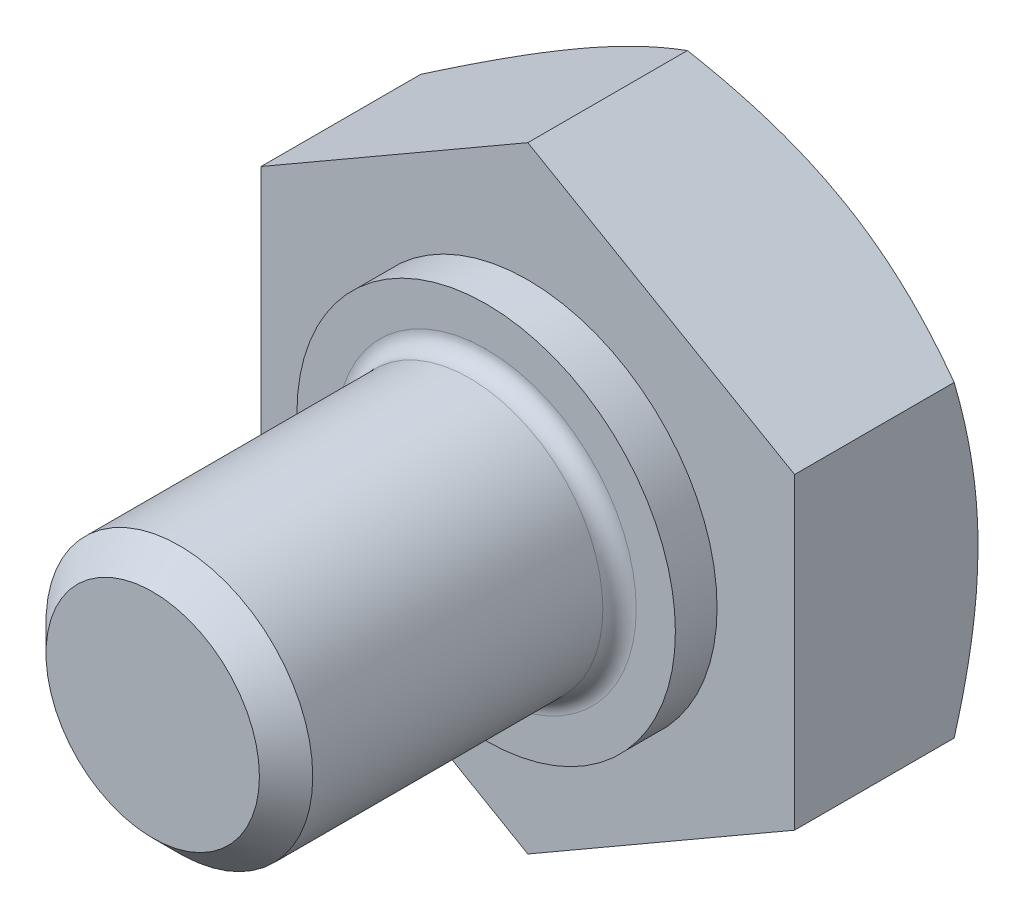
ISO-10303-21;
HEADER;
FILE_DESCRIPTION(('STEP AP214'),'2;1');
FILE_NAME('part.step','',(''),(''),'','','');
FILE_SCHEMA(('AUTOMOTIVE_DESIGN { 1 0 10303 214 1 1 1 1 }'));
ENDSEC;
DATA;
#1=APPLICATION_CONTEXT('core data for automotive mechanical design processes');
#2=APPLICATION_PROTOCOL_DEFINITION('international standard','automotive_design',2000,#1);
#3=PRODUCT_CONTEXT('',#1,'mechanical');
#4=PRODUCT('Part','Part','',(#3));
#5=PRODUCT_RELATED_PRODUCT_CATEGORY('part','',(#4));
#6=PRODUCT_DEFINITION_FORMATION('','',#4);
#7=PRODUCT_DEFINITION_CONTEXT('part definition',#1,'design');
#8=PRODUCT_DEFINITION('design','',#6,#7);
#9=PRODUCT_DEFINITION_SHAPE('','',#8);
#10=(LENGTH_UNIT() NAMED_UNIT(*) SI_UNIT(.MILLI.,.METRE.));
#11=(NAMED_UNIT(*) PLANE_ANGLE_UNIT() SI_UNIT($,.RADIAN.));
#12=(NAMED_UNIT(*) SI_UNIT($,.STERADIAN.) SOLID_ANGLE_UNIT());
#13=UNCERTAINTY_MEASURE_WITH_UNIT(LENGTH_MEASURE(1.E-05),#10,'distance_accuracy_value','');
#14=(GEOMETRIC_REPRESENTATION_CONTEXT(3) GLOBAL_UNCERTAINTY_ASSIGNED_CONTEXT((#13)) GLOBAL_UNIT_ASSIGNED_CONTEXT((#10,
#11,#12)) REPRESENTATION_CONTEXT('',''));
#15=CARTESIAN_POINT('',(0.,0.,0.));
#16=DIRECTION('',(0.,0.,1.));
#17=DIRECTION('',(1.,0.,0.));
#18=AXIS2_PLACEMENT_3D('',#15,#16,#17);
#19=CARTESIAN_POINT('',(0.,0.,1.35));
#20=DIRECTION('',(0.,0.,1.));
#21=DIRECTION('',(1.,0.,0.));
#22=AXIS2_PLACEMENT_3D('',#19,#20,#21);
#23=PLANE('',#22);
#24=CARTESIAN_POINT('',(0.,0.,1.35));
#25=DIRECTION('',(0.,0.,1.));
#26=DIRECTION('',(1.,0.,0.));
#27=AXIS2_PLACEMENT_3D('',#24,#25,#26);
#28=CIRCLE('',#27,0.9);
#29=CARTESIAN_POINT('',(0.9,0.,1.35));
#30=VERTEX_POINT('',#29);
#31=EDGE_CURVE('E11',#30,#30,#28,.F.);
#32=ORIENTED_EDGE('',*,*,#31,.T.);
#33=EDGE_LOOP('',(#32));
#34=FACE_BOUND('',#33,.T.);
#35=CARTESIAN_POINT('',(0.,0.,1.35));
#36=DIRECTION('',(0.,0.,1.));
#37=DIRECTION('',(1.,0.,0.));
#38=AXIS2_PLACEMENT_3D('',#35,#36,#37);
#39=CIRCLE('',#38,1.135);
#40=CARTESIAN_POINT('',(1.135,0.,1.35));
#41=VERTEX_POINT('',#40);
#42=EDGE_CURVE('E264',#41,#41,#39,.T.);
#43=ORIENTED_EDGE('',*,*,#42,.T.);
#44=EDGE_LOOP('',(#43));
#45=FACE_BOUND('',#44,.T.);
#46=ADVANCED_FACE('F29',(#34,#45),#23,.T.);
#47=CARTESIAN_POINT('',(3.19999999999999,0.,1.1));
#48=DIRECTION('',(0.,0.,1.));
#49=DIRECTION('',(1.,0.,0.));
#50=AXIS2_PLACEMENT_3D('',#47,#48,#49);
#51=PLANE('',#50);
#52=DIRECTION('',(0.866025403784438,0.500000000000002,0.));
#53=VECTOR('',#52,1.);
#54=CARTESIAN_POINT('',(0.,-1.84752086140681,1.1));
#55=LINE('',#54,#53);
#56=CARTESIAN_POINT('',(0.,-1.84752086140681,1.1));
#57=VERTEX_POINT('',#56);
#58=CARTESIAN_POINT('',(1.59999999999998,-0.923760430703406,1.1));
#59=VERTEX_POINT('',#58);
#60=EDGE_CURVE('E284',#57,#59,#55,.T.);
#61=ORIENTED_EDGE('',*,*,#60,.T.);
#62=DIRECTION('',(0.,1.,0.));
#63=VECTOR('',#62,1.);
#64=CARTESIAN_POINT('',(1.59999999999998,-0.923760430703406,1.1));
#65=LINE('',#64,#63);
#66=CARTESIAN_POINT('',(1.59999999999998,0.92376043070341,1.1));
#67=VERTEX_POINT('',#66);
#68=EDGE_CURVE('E289',#59,#67,#65,.T.);
#69=ORIENTED_EDGE('',*,*,#68,.T.);
#70=DIRECTION('',(-0.866025403784438,0.5,0.));
#71=VECTOR('',#70,1.);
#72=CARTESIAN_POINT('',(1.59999999999998,0.92376043070341,1.1));
#73=LINE('',#72,#71);
#74=CARTESIAN_POINT('',(0.,1.84752086140681,1.1));
#75=VERTEX_POINT('',#74);
#76=EDGE_CURVE('E286',#67,#75,#73,.T.);
#77=ORIENTED_EDGE('',*,*,#76,.T.);
#78=DIRECTION('',(-0.866025403784438,-0.500000000000001,0.));
#79=VECTOR('',#78,1.);
#80=CARTESIAN_POINT('',(0.,1.84752086140681,1.1));
#81=LINE('',#80,#79);
#82=CARTESIAN_POINT('',(-1.6,0.923760430703403,1.1));
#83=VERTEX_POINT('',#82);
#84=EDGE_CURVE('E285',#75,#83,#81,.T.);
#85=ORIENTED_EDGE('',*,*,#84,.T.);
#86=DIRECTION('',(0.,-1.,0.));
#87=VECTOR('',#86,1.);
#88=CARTESIAN_POINT('',(-1.6,0.923760430703403,1.1));
#89=LINE('',#88,#87);
#90=CARTESIAN_POINT('',(-1.6,-0.92376043070341,1.1));
#91=VERTEX_POINT('',#90);
#92=EDGE_CURVE('E207',#83,#91,#89,.T.);
#93=ORIENTED_EDGE('',*,*,#92,.T.);
#94=DIRECTION('',(0.86602540378444,-0.499999999999998,0.));
#95=VECTOR('',#94,1.);
#96=CARTESIAN_POINT('',(-1.6,-0.92376043070341,1.1));
#97=LINE('',#96,#95);
#98=EDGE_CURVE('E279',#91,#57,#97,.T.);
#99=ORIENTED_EDGE('',*,*,#98,.T.);
#100=EDGE_LOOP('',(#61,#69,#77,#85,#93,#99));
#101=FACE_BOUND('',#100,.T.);
#102=CARTESIAN_POINT('',(0.,0.,1.1));
#103=DIRECTION('',(0.,0.,1.));
#104=DIRECTION('',(1.,0.,0.));
#105=AXIS2_PLACEMENT_3D('',#102,#103,#104);
#106=CIRCLE('',#105,1.135);
#107=CARTESIAN_POINT('',(1.135,0.,1.1));
#108=VERTEX_POINT('',#107);
#109=EDGE_CURVE('E267',#108,#108,#106,.T.);
#110=ORIENTED_EDGE('',*,*,#109,.F.);
#111=EDGE_LOOP('',(#110));
#112=FACE_BOUND('',#111,.T.);
#113=ADVANCED_FACE('F244',(#101,#112),#51,.T.);
#114=CARTESIAN_POINT('',(0.,-1.84752086140681,1.1));
#115=DIRECTION('',(-0.500000000000002,0.866025403784438,0.));
#116=DIRECTION('',(-0.866025403784438,-0.500000000000002,0.));
#117=AXIS2_PLACEMENT_3D('',#114,#115,#116);
#118=PLANE('',#117);
#119=CARTESIAN_POINT('',(1.60019999999998,-0.923644960649568,0.142972908879542));
#120=CARTESIAN_POINT('',(1.5298863145426,-0.964240585876106,0.11952386935105));
#121=CARTESIAN_POINT('',(1.45896568981642,-1.00518662765286,0.098197358855812));
#122=CARTESIAN_POINT('',(1.31589622208531,-1.08778782336023,0.0609706558641393));
#123=CARTESIAN_POINT('',(1.24374483580212,-1.12944444565324,0.0450836346469265));
#124=CARTESIAN_POINT('',(1.10033630057876,-1.21224140206853,0.0203517145647526));
#125=CARTESIAN_POINT('',(1.02910122444318,-1.25336899245116,0.0113422364016158));
#126=CARTESIAN_POINT('',(0.88629566576709,-1.33581782019457,0.000584271244003232));
#127=CARTESIAN_POINT('',(0.814725702734529,-1.37713875761731,-0.00117312160480874));
#128=CARTESIAN_POINT('',(0.680978543862262,-1.45435771579556,0.00247117305863848));
#129=CARTESIAN_POINT('',(0.618781387401724,-1.49026726082089,0.00697805908761822));
#130=CARTESIAN_POINT('',(0.494792313483926,-1.5618523860239,0.0212658761938158));
#131=CARTESIAN_POINT('',(0.433000825294987,-1.59752771836341,0.0310516940962195));
#132=CARTESIAN_POINT('',(0.308755841646633,-1.66926059311825,0.0555169113295007));
#133=CARTESIAN_POINT('',(0.246318081755422,-1.70530905059904,0.0703000799228658));
#134=CARTESIAN_POINT('',(0.12237412816225,-1.77686812557048,0.103852607783296));
#135=CARTESIAN_POINT('',(0.0608663449577899,-1.81237966076083,0.12261407674397));
#136=CARTESIAN_POINT('',(-0.000200000000005281,-1.84763633146064,0.142972908879547));
#137=B_SPLINE_CURVE_WITH_KNOTS('',3,(#119,#120,#121,#122,#123,#124,#125,#126,#127,#128,#129,
#130,#131,#132,#133,#134,#135,#136),.UNSPECIFIED.,.F.,.F.,(4,2,2,2,2,2,2,2,4),(0.,
0.253628622662479,0.50786711350524,0.755812447259189,1.00345320332839,1.21912891721901,
1.4350046304192,1.65567058644227,1.87590291418784),.UNSPECIFIED.);
#138=CARTESIAN_POINT('',(1.59999999999998,-0.923760430703406,0.142906235963266));
#139=VERTEX_POINT('',#138);
#140=CARTESIAN_POINT('',(0.799999999999992,-1.38564064605509,0.));
#141=VERTEX_POINT('',#140);
#142=EDGE_CURVE('E122',#139,#141,#137,.T.);
#143=ORIENTED_EDGE('',*,*,#142,.F.);
#144=DIRECTION('',(0.,0.,-1.));
#145=VECTOR('',#144,1.);
#146=CARTESIAN_POINT('',(1.59999999999998,-0.923760430703406,1.1));
#147=LINE('',#146,#145);
#148=EDGE_CURVE('E126',#59,#139,#147,.T.);
#149=ORIENTED_EDGE('',*,*,#148,.F.);
#150=ORIENTED_EDGE('',*,*,#60,.F.);
#151=DIRECTION('',(0.,0.,-1.));
#152=VECTOR('',#151,1.);
#153=CARTESIAN_POINT('',(0.,-1.84752086140681,1.1));
#154=LINE('',#153,#152);
#155=CARTESIAN_POINT('',(0.,-1.84752086140681,0.142906235963271));
#156=VERTEX_POINT('',#155);
#157=EDGE_CURVE('E214',#57,#156,#154,.T.);
#158=ORIENTED_EDGE('',*,*,#157,.T.);
#159=EDGE_CURVE('E181',#141,#156,#137,.T.);
#160=ORIENTED_EDGE('',*,*,#159,.F.);
#161=EDGE_LOOP('',(#143,#149,#150,#158,#160));
#162=FACE_BOUND('',#161,.T.);
#163=ADVANCED_FACE('F31',(#162),#118,.F.);
#164=CARTESIAN_POINT('',(1.59999999999998,-0.923760430703406,1.1));
#165=DIRECTION('',(-1.,0.,0.));
#166=DIRECTION('',(0.,0.,1.));
#167=AXIS2_PLACEMENT_3D('',#164,#165,#166);
#168=PLANE('',#167);
#169=CARTESIAN_POINT('',(1.59999999999998,-2.50686518787018,0.79324986533982));
#170=CARTESIAN_POINT('',(1.59999999999998,-2.43675518738722,0.75913835209417));
#171=CARTESIAN_POINT('',(1.59999999999998,-2.36648694224545,0.725346643567428));
#172=CARTESIAN_POINT('',(1.59999999999998,-2.22554988703377,0.658582233282984));
#173=CARTESIAN_POINT('',(1.59999999999998,-2.15488101814175,0.625609655832461));
#174=CARTESIAN_POINT('',(1.59999999999998,-2.01270674700472,0.56050249614431));
#175=CARTESIAN_POINT('',(1.59999999999998,-1.94119889975116,0.528373235066634));
#176=CARTESIAN_POINT('',(1.59999999999998,-1.79762321530926,0.465396150816147));
#177=CARTESIAN_POINT('',(1.59999999999998,-1.72555540405083,0.43454826872212));
#178=CARTESIAN_POINT('',(1.59999999999998,-1.5783346013834,0.373471382613714));
#179=CARTESIAN_POINT('',(1.59999999999998,-1.50315876329904,0.34329715444466));
#180=CARTESIAN_POINT('',(1.59999999999998,-1.35195202264701,0.285177245313619));
#181=CARTESIAN_POINT('',(1.59999999999998,-1.27592119607487,0.257231368043774));
#182=CARTESIAN_POINT('',(1.59999999999998,-1.12299542738775,0.204273607988167));
#183=CARTESIAN_POINT('',(1.59999999999998,-1.04610238797296,0.179256284858179));
#184=CARTESIAN_POINT('',(1.59999999999998,-0.891213659446835,0.132944553838915));
#185=CARTESIAN_POINT('',(1.59999999999998,-0.813218317614943,0.111649000475552));
#186=CARTESIAN_POINT('',(1.59999999999998,-0.656508665475043,0.0738981947096377));
#187=CARTESIAN_POINT('',(1.59999999999998,-0.577800879093961,0.0574163551150369));
#188=CARTESIAN_POINT('',(1.59999999999998,-0.419381080143741,0.0302089325737662));
#189=CARTESIAN_POINT('',(1.59999999999998,-0.339669174347317,0.0194827428026495));
#190=CARTESIAN_POINT('',(1.59999999999998,-0.180687919886303,0.00478431661393051));
#191=CARTESIAN_POINT('',(1.59999999999998,-0.101427025167892,0.000723232155597961));
#192=CARTESIAN_POINT('',(1.59999999999998,0.0571483263282758,-0.0005463727151529));
#193=CARTESIAN_POINT('',(1.59999999999998,0.136462784076389,0.00224523453778668));
#194=CARTESIAN_POINT('',(1.59999999999998,0.325203375392627,0.0168023324629075));
#195=CARTESIAN_POINT('',(1.59999999999998,0.434395717489695,0.0316243965590829));
#196=CARTESIAN_POINT('',(1.59999999999998,0.650841268396235,0.0717296879551892));
#197=CARTESIAN_POINT('',(1.59999999999998,0.758092592299301,0.0970225683323687));
#198=CARTESIAN_POINT('',(1.59999999999998,0.972906431900276,0.155960648282551));
#199=CARTESIAN_POINT('',(1.59999999999998,1.08041811502138,0.189786507617054));
#200=CARTESIAN_POINT('',(1.59999999999998,1.24017964910481,0.244747133967778));
#201=CARTESIAN_POINT('',(1.59999999999998,1.29317816022643,0.263769228836648));
#202=CARTESIAN_POINT('',(1.59999999999998,1.39873417216727,0.303000143976721));
#203=CARTESIAN_POINT('',(1.59999999999998,1.45129168214402,0.3232089395357));
#204=CARTESIAN_POINT('',(1.59999999999998,1.58993798128715,0.378025359347995));
#205=CARTESIAN_POINT('',(1.59999999999998,1.67569128018704,0.413479494452311));
#206=CARTESIAN_POINT('',(1.59999999999998,1.84633899543307,0.48640431434303));
#207=CARTESIAN_POINT('',(1.59999999999998,1.93123332713226,0.523875195614168));
#208=CARTESIAN_POINT('',(1.59999999999998,2.18493743145586,0.638587116110995));
#209=CARTESIAN_POINT('',(1.59999999999998,2.35271482252451,0.718105522437217));
#210=CARTESIAN_POINT('',(1.59999999999998,2.6867192901371,0.880912771738444));
#211=CARTESIAN_POINT('',(1.59999999999998,2.85294363764132,0.964207136226201));
#212=CARTESIAN_POINT('',(1.59999999999998,3.18414349158474,1.13315987583359));
#213=CARTESIAN_POINT('',(1.59999999999998,3.34911923196155,1.21881779341063));
#214=CARTESIAN_POINT('',(1.59999999999998,3.66140040152887,1.38290591171546));
#215=CARTESIAN_POINT('',(1.59999999999998,3.8087882481298,1.46117988205759));
#216=CARTESIAN_POINT('',(1.59999999999998,4.10306216550771,1.61868453231111));
#217=CARTESIAN_POINT('',(1.59999999999998,4.2499482073772,1.69791526618513));
#218=CARTESIAN_POINT('',(1.59999999999998,4.54286507530132,1.85683393370044));
#219=CARTESIAN_POINT('',(1.59999999999998,4.68889713437127,1.9365195979977));
#220=CARTESIAN_POINT('',(1.59999999999998,4.98064729896738,2.09643824954937));
#221=CARTESIAN_POINT('',(1.59999999999998,5.12636542697712,2.1766711957686));
#222=CARTESIAN_POINT('',(1.59999999999998,5.27197248368768,2.2571039103607));
#223=B_SPLINE_CURVE_WITH_KNOTS('',3,(#169,#170,#171,#172,#173,#174,#175,#176,#177,#178,#179,
#180,#181,#182,#183,#184,#185,#186,#187,#188,#189,#190,#191,#192,#193,#194,#195,#196,#197,#198,
#199,#200,#201,#202,#203,#204,#205,#206,#207,#208,#209,#210,#211,#212,#213,#214,#215,#216,#217,
#218,#219,#220,#221,#222),.UNSPECIFIED.,.F.,.F.,(4,2,2,2,2,2,2,2,2,2,2,2,2,2,2,2,2,2,2,2,2,2,2,
2,2,2,4),(0.,0.233906709060854,0.467848700424888,0.703021430625301,0.938183334959663,
1.18117263764748,1.42414051034794,1.66664961014428,1.90908393933618,2.15015276773407,
2.39119617498581,2.6289994958933,2.86680724710026,3.19670862108224,3.52691481182926,
3.8648047721898,4.03372172262057,4.20263515671885,4.48097836170414,4.75934873398533,
5.31626276994425,5.87401923905625,6.43166848344699,6.93231405458062,7.43298799585582,
7.93206238705658,8.4310997602284),.UNSPECIFIED.);
#224=CARTESIAN_POINT('',(1.59999999999998,0.92376043070341,0.142906235963267));
#225=VERTEX_POINT('',#224);
#226=CARTESIAN_POINT('',(1.59999999999998,0.,0.));
#227=VERTEX_POINT('',#226);
#228=EDGE_CURVE('E101',#225,#227,#223,.F.);
#229=ORIENTED_EDGE('',*,*,#228,.F.);
#230=DIRECTION('',(0.,0.,-1.));
#231=VECTOR('',#230,1.);
#232=CARTESIAN_POINT('',(1.59999999999998,0.92376043070341,1.1));
#233=LINE('',#232,#231);
#234=EDGE_CURVE('E211',#67,#225,#233,.T.);
#235=ORIENTED_EDGE('',*,*,#234,.F.);
#236=ORIENTED_EDGE('',*,*,#68,.F.);
#237=ORIENTED_EDGE('',*,*,#148,.T.);
#238=EDGE_CURVE('E114',#227,#139,#223,.F.);
#239=ORIENTED_EDGE('',*,*,#238,.F.);
#240=EDGE_LOOP('',(#229,#235,#236,#237,#239));
#241=FACE_BOUND('',#240,.T.);
#242=ADVANCED_FACE('F133',(#241),#168,.F.);
#243=CARTESIAN_POINT('',(1.59999999999998,0.92376043070341,1.1));
#244=DIRECTION('',(-0.5,-0.866025403784438,0.));
#245=DIRECTION('',(0.866025403784439,-0.5,0.));
#246=AXIS2_PLACEMENT_3D('',#243,#244,#245);
#247=PLANE('',#246);
#248=CARTESIAN_POINT('',(-0.00020000000000589,1.84763633146064,0.142972908879547));
#249=CARTESIAN_POINT('',(0.0701136854573819,1.80704070623411,0.119523869351056));
#250=CARTESIAN_POINT('',(0.141034310183553,1.76609466445735,0.0981973588558167));
#251=CARTESIAN_POINT('',(0.284103777914671,1.68349346874998,0.060970655864143));
#252=CARTESIAN_POINT('',(0.35625516419786,1.64183684645697,0.0450836346469297));
#253=CARTESIAN_POINT('',(0.499663699421217,1.55903989004168,0.0203517145647551));
#254=CARTESIAN_POINT('',(0.570898775556801,1.51791229965905,0.0113422364016179));
#255=CARTESIAN_POINT('',(0.713704334232892,1.43546347191564,0.000584271244004546));
#256=CARTESIAN_POINT('',(0.785274297265453,1.3941425344929,-0.00117312160480784));
#257=CARTESIAN_POINT('',(0.91902145613772,1.31692357631465,0.00247117305863862));
#258=CARTESIAN_POINT('',(0.981218612598258,1.28101403128933,0.00697805908761794));
#259=CARTESIAN_POINT('',(1.10520768651605,1.20942890608631,0.0212658761938146));
#260=CARTESIAN_POINT('',(1.16699917470499,1.1737535737468,0.0310516940962179));
#261=CARTESIAN_POINT('',(1.29124415835335,1.10202069899196,0.0555169113294983));
#262=CARTESIAN_POINT('',(1.35368191824456,1.06597224151118,0.0703000799228629));
#263=CARTESIAN_POINT('',(1.47762587183773,0.994413166539733,0.103852607783292));
#264=CARTESIAN_POINT('',(1.53913365504219,0.958901631349381,0.122614076743966));
#265=CARTESIAN_POINT('',(1.60019999999998,0.923644960649572,0.142972908879543));
#266=B_SPLINE_CURVE_WITH_KNOTS('',3,(#248,#249,#250,#251,#252,#253,#254,#255,#256,#257,#258,
#259,#260,#261,#262,#263,#264,#265),.UNSPECIFIED.,.F.,.F.,(4,2,2,2,2,2,2,2,4),(0.,
0.25362862266248,0.507867113505243,0.755812447259193,1.00345320332839,1.21912891721901,
1.4350046304192,1.65567058644227,1.87590291418784),.UNSPECIFIED.);
#267=CARTESIAN_POINT('',(0.,1.84752086140681,0.142906235963271));
#268=VERTEX_POINT('',#267);
#269=CARTESIAN_POINT('',(0.799999999999989,1.38564064605509,0.));
#270=VERTEX_POINT('',#269);
#271=EDGE_CURVE('E45',#268,#270,#266,.T.);
#272=ORIENTED_EDGE('',*,*,#271,.F.);
#273=DIRECTION('',(0.,0.,-1.));
#274=VECTOR('',#273,1.);
#275=CARTESIAN_POINT('',(0.,1.84752086140681,1.1));
#276=LINE('',#275,#274);
#277=EDGE_CURVE('E208',#75,#268,#276,.T.);
#278=ORIENTED_EDGE('',*,*,#277,.F.);
#279=ORIENTED_EDGE('',*,*,#76,.F.);
#280=ORIENTED_EDGE('',*,*,#234,.T.);
#281=EDGE_CURVE('E108',#270,#225,#266,.T.);
#282=ORIENTED_EDGE('',*,*,#281,.F.);
#283=EDGE_LOOP('',(#272,#278,#279,#280,#282));
#284=FACE_BOUND('',#283,.T.);
#285=ADVANCED_FACE('F158',(#284),#247,.F.);
#286=CARTESIAN_POINT('',(0.,1.84752086140681,1.1));
#287=DIRECTION('',(0.500000000000001,-0.866025403784438,0.));
#288=DIRECTION('',(0.866025403784438,0.500000000000001,0.));
#289=AXIS2_PLACEMENT_3D('',#286,#287,#288);
#290=PLANE('',#289);
#291=CARTESIAN_POINT('',(-1.6002,0.923644960649565,0.142972908879545));
#292=CARTESIAN_POINT('',(-1.52988631454262,0.964240585876103,0.119523869351054));
#293=CARTESIAN_POINT('',(-1.45896568981645,1.00518662765285,0.0981973588558151));
#294=CARTESIAN_POINT('',(-1.31589622208533,1.08778782336023,0.0609706558641417));
#295=CARTESIAN_POINT('',(-1.24374483580214,1.12944444565324,0.0450836346469286));
#296=CARTESIAN_POINT('',(-1.10033630057878,1.21224140206853,0.0203517145647541));
#297=CARTESIAN_POINT('',(-1.0291012244432,1.25336899245115,0.011342236401617));
#298=CARTESIAN_POINT('',(-0.886295665767108,1.33581782019457,0.000584271244003903));
#299=CARTESIAN_POINT('',(-0.814725702734547,1.37713875761731,-0.00117312160480829));
#300=CARTESIAN_POINT('',(-0.680978543862279,1.45435771579556,0.00247117305863846));
#301=CARTESIAN_POINT('',(-0.618781387401741,1.49026726082088,0.00697805908761797));
#302=CARTESIAN_POINT('',(-0.494792313483942,1.5618523860239,0.0212658761938153));
#303=CARTESIAN_POINT('',(-0.433000825295002,1.59752771836341,0.0310516940962191));
#304=CARTESIAN_POINT('',(-0.308755841646647,1.66926059311825,0.0555169113295003));
#305=CARTESIAN_POINT('',(-0.246318081755435,1.70530905059904,0.0703000799228654));
#306=CARTESIAN_POINT('',(-0.122374128162263,1.77686812557048,0.103852607783295));
#307=CARTESIAN_POINT('',(-0.0608663449578016,1.81237966076083,0.12261407674397));
#308=CARTESIAN_POINT('',(0.000199999999994012,1.84763633146064,0.142972908879547));
#309=B_SPLINE_CURVE_WITH_KNOTS('',3,(#291,#292,#293,#294,#295,#296,#297,#298,#299,#300,#301,
#302,#303,#304,#305,#306,#307,#308),.UNSPECIFIED.,.F.,.F.,(4,2,2,2,2,2,2,2,4),(0.,
0.25362862266248,0.507867113505242,0.755812447259191,1.00345320332839,1.21912891721902,
1.43500463041921,1.65567058644228,1.87590291418785),.UNSPECIFIED.);
#310=CARTESIAN_POINT('',(-1.6,0.923760430703403,0.142906235963269));
#311=VERTEX_POINT('',#310);
#312=CARTESIAN_POINT('',(-0.800000000000002,1.38564064605509,0.));
#313=VERTEX_POINT('',#312);
#314=EDGE_CURVE('E53',#311,#313,#309,.T.);
#315=ORIENTED_EDGE('',*,*,#314,.F.);
#316=DIRECTION('',(0.,0.,-1.));
#317=VECTOR('',#316,1.);
#318=CARTESIAN_POINT('',(-1.6,0.923760430703403,1.1));
#319=LINE('',#318,#317);
#320=EDGE_CURVE('E203',#83,#311,#319,.T.);
#321=ORIENTED_EDGE('',*,*,#320,.F.);
#322=ORIENTED_EDGE('',*,*,#84,.F.);
#323=ORIENTED_EDGE('',*,*,#277,.T.);
#324=EDGE_CURVE('E113',#313,#268,#309,.T.);
#325=ORIENTED_EDGE('',*,*,#324,.F.);
#326=EDGE_LOOP('',(#315,#321,#322,#323,#325));
#327=FACE_BOUND('',#326,.T.);
#328=ADVANCED_FACE('F161',(#327),#290,.F.);
#329=CARTESIAN_POINT('',(-1.6,0.923760430703403,1.1));
#330=DIRECTION('',(1.,0.,0.));
#331=DIRECTION('',(0.,0.,-1.));
#332=AXIS2_PLACEMENT_3D('',#329,#330,#331);
#333=PLANE('',#332);
#334=CARTESIAN_POINT('',(-1.6,-2.50686518787019,0.793249865339828));
#335=CARTESIAN_POINT('',(-1.6,-2.43675518738723,0.759138352094178));
#336=CARTESIAN_POINT('',(-1.6,-2.36648694224546,0.725346643567436));
#337=CARTESIAN_POINT('',(-1.6,-2.22554988703378,0.658582233282992));
#338=CARTESIAN_POINT('',(-1.6,-2.15488101814176,0.625609655832469));
#339=CARTESIAN_POINT('',(-1.6,-2.01270674700473,0.560502496144317));
#340=CARTESIAN_POINT('',(-1.6,-1.94119889975117,0.528373235066641));
#341=CARTESIAN_POINT('',(-1.6,-1.79762321530926,0.465396150816154));
#342=CARTESIAN_POINT('',(-1.6,-1.72555540405084,0.434548268722127));
#343=CARTESIAN_POINT('',(-1.6,-1.57833460138341,0.373471382613721));
#344=CARTESIAN_POINT('',(-1.6,-1.50315876329905,0.343297154444666));
#345=CARTESIAN_POINT('',(-1.6,-1.35195202264701,0.285177245313626));
#346=CARTESIAN_POINT('',(-1.6,-1.27592119607488,0.257231368043781));
#347=CARTESIAN_POINT('',(-1.6,-1.12299542738775,0.204273607988173));
#348=CARTESIAN_POINT('',(-1.6,-1.04610238797296,0.179256284858184));
#349=CARTESIAN_POINT('',(-1.6,-0.891213659446839,0.132944553838921));
#350=CARTESIAN_POINT('',(-1.6,-0.813218317614947,0.111649000475557));
#351=CARTESIAN_POINT('',(-1.6,-0.656508665475045,0.0738981947096431));
#352=CARTESIAN_POINT('',(-1.6,-0.577800879093963,0.0574163551150421));
#353=CARTESIAN_POINT('',(-1.6,-0.419381080143742,0.0302089325737713));
#354=CARTESIAN_POINT('',(-1.6,-0.339669174347318,0.0194827428026546));
#355=CARTESIAN_POINT('',(-1.6,-0.180687919886303,0.00478431661393563));
#356=CARTESIAN_POINT('',(-1.6,-0.101427025167891,0.000723232155603056));
#357=CARTESIAN_POINT('',(-1.6,0.0571483263282772,-0.00054637271514773));
#358=CARTESIAN_POINT('',(-1.6,0.136462784076391,0.00224523453779196));
#359=CARTESIAN_POINT('',(-1.6,0.32520337539263,0.016802332462913));
#360=CARTESIAN_POINT('',(-1.6,0.434395717489699,0.0316243965590885));
#361=CARTESIAN_POINT('',(-1.6,0.65084126839624,0.0717296879551951));
#362=CARTESIAN_POINT('',(-1.6,0.758092592299307,0.0970225683323747));
#363=CARTESIAN_POINT('',(-1.6,0.972906431900282,0.155960648282558));
#364=CARTESIAN_POINT('',(-1.6,1.08041811502139,0.18978650761706));
#365=CARTESIAN_POINT('',(-1.6,1.24017964910482,0.244747133967785));
#366=CARTESIAN_POINT('',(-1.6,1.29317816022644,0.263769228836655));
#367=CARTESIAN_POINT('',(-1.6,1.39873417216728,0.303000143976728));
#368=CARTESIAN_POINT('',(-1.6,1.45129168214403,0.323208939535707));
#369=CARTESIAN_POINT('',(-1.6,1.58993798128716,0.378025359348002));
#370=CARTESIAN_POINT('',(-1.6,1.67569128018705,0.413479494452319));
#371=CARTESIAN_POINT('',(-1.6,1.84633899543308,0.486404314343038));
#372=CARTESIAN_POINT('',(-1.6,1.93123332713227,0.523875195614175));
#373=CARTESIAN_POINT('',(-1.6,2.18493743145587,0.638587116111002));
#374=CARTESIAN_POINT('',(-1.6,2.35271482252452,0.718105522437223));
#375=CARTESIAN_POINT('',(-1.6,2.68671929013711,0.880912771738451));
#376=CARTESIAN_POINT('',(-1.6,2.85294363764133,0.964207136226207));
#377=CARTESIAN_POINT('',(-1.6,3.18414349158474,1.1331598758336));
#378=CARTESIAN_POINT('',(-1.6,3.34911923196156,1.21881779341064));
#379=CARTESIAN_POINT('',(-1.6,3.66140040152887,1.38290591171547));
#380=CARTESIAN_POINT('',(-1.6,3.80878824812981,1.46117988205759));
#381=CARTESIAN_POINT('',(-1.6,4.10306216550771,1.61868453231111));
#382=CARTESIAN_POINT('',(-1.6,4.24994820737721,1.69791526618513));
#383=CARTESIAN_POINT('',(-1.6,4.54286507530133,1.85683393370045));
#384=CARTESIAN_POINT('',(-1.6,4.68889713437127,1.9365195979977));
#385=CARTESIAN_POINT('',(-1.6,4.98064729896738,2.09643824954938));
#386=CARTESIAN_POINT('',(-1.6,5.12636542697712,2.1766711957686));
#387=CARTESIAN_POINT('',(-1.6,5.27197248368768,2.2571039103607));
#388=B_SPLINE_CURVE_WITH_KNOTS('',3,(#334,#335,#336,#337,#338,#339,#340,#341,#342,#343,#344,
#345,#346,#347,#348,#349,#350,#351,#352,#353,#354,#355,#356,#357,#358,#359,#360,#361,#362,#363,
#364,#365,#366,#367,#368,#369,#370,#371,#372,#373,#374,#375,#376,#377,#378,#379,#380,#381,#382,
#383,#384,#385,#386,#387),.UNSPECIFIED.,.F.,.F.,(4,2,2,2,2,2,2,2,2,2,2,2,2,2,2,2,2,2,2,2,2,2,2,
2,2,2,4),(0.,0.233906709060855,0.467848700424891,0.703021430625305,0.938183334959668,
1.18117263764748,1.42414051034795,1.66664961014428,1.90908393933619,2.15015276773408,
2.39119617498583,2.62899949589331,2.86680724710028,3.19670862108226,3.52691481182928,
3.86480477218982,4.03372172262059,4.20263515671887,4.48097836170416,4.75934873398535,
5.31626276994427,5.87401923905627,6.431668483447,6.93231405458064,7.43298799585584,
7.93206238705659,8.43109976022842),.UNSPECIFIED.);
#389=CARTESIAN_POINT('',(-1.6,-0.92376043070341,0.142906235963271));
#390=VERTEX_POINT('',#389);
#391=CARTESIAN_POINT('',(-1.59999999999999,0.,0.));
#392=VERTEX_POINT('',#391);
#393=EDGE_CURVE('E176',#390,#392,#388,.T.);
#394=ORIENTED_EDGE('',*,*,#393,.F.);
#395=DIRECTION('',(0.,0.,-1.));
#396=VECTOR('',#395,1.);
#397=CARTESIAN_POINT('',(-1.6,-0.92376043070341,1.1));
#398=LINE('',#397,#396);
#399=EDGE_CURVE('E209',#91,#390,#398,.T.);
#400=ORIENTED_EDGE('',*,*,#399,.F.);
#401=ORIENTED_EDGE('',*,*,#92,.F.);
#402=ORIENTED_EDGE('',*,*,#320,.T.);
#403=EDGE_CURVE('E135',#392,#311,#388,.T.);
#404=ORIENTED_EDGE('',*,*,#403,.F.);
#405=EDGE_LOOP('',(#394,#400,#401,#402,#404));
#406=FACE_BOUND('',#405,.T.);
#407=ADVANCED_FACE('F166',(#406),#333,.F.);
#408=CARTESIAN_POINT('',(-1.6,-0.92376043070341,1.1));
#409=DIRECTION('',(0.499999999999998,0.86602540378444,0.));
#410=DIRECTION('',(-0.86602540378444,0.499999999999998,0.));
#411=AXIS2_PLACEMENT_3D('',#408,#409,#410);
#412=PLANE('',#411);
#413=CARTESIAN_POINT('',(0.000199999999994711,-1.84763633146064,0.142972908879547));
#414=CARTESIAN_POINT('',(-0.0701136854573934,-1.80704070623411,0.119523869351056));
#415=CARTESIAN_POINT('',(-0.141034310183565,-1.76609466445735,0.098197358855817));
#416=CARTESIAN_POINT('',(-0.284103777914683,-1.68349346874998,0.0609706558641435));
#417=CARTESIAN_POINT('',(-0.356255164197872,-1.64183684645697,0.0450836346469304));
#418=CARTESIAN_POINT('',(-0.49966369942123,-1.55903989004168,0.0203517145647559));
#419=CARTESIAN_POINT('',(-0.570898775556813,-1.51791229965906,0.0113422364016188));
#420=CARTESIAN_POINT('',(-0.713704334232904,-1.43546347191564,0.000584271244005628));
#421=CARTESIAN_POINT('',(-0.785274297265465,-1.3941425344929,-0.00117312160480663));
#422=CARTESIAN_POINT('',(-0.919021456137733,-1.31692357631465,0.00247117305864009));
#423=CARTESIAN_POINT('',(-0.981218612598271,-1.28101403128933,0.00697805908761958));
#424=CARTESIAN_POINT('',(-1.10520768651607,-1.20942890608632,0.0212658761938167));
#425=CARTESIAN_POINT('',(-1.16699917470501,-1.1737535737468,0.0310516940962202));
#426=CARTESIAN_POINT('',(-1.29124415835336,-1.10202069899197,0.0555169113295011));
#427=CARTESIAN_POINT('',(-1.35368191824458,-1.06597224151118,0.0703000799228661));
#428=CARTESIAN_POINT('',(-1.47762587183775,-0.994413166539734,0.103852607783296));
#429=CARTESIAN_POINT('',(-1.53913365504221,-0.958901631349381,0.12261407674397));
#430=CARTESIAN_POINT('',(-1.6002,-0.923644960649572,0.142972908879547));
#431=B_SPLINE_CURVE_WITH_KNOTS('',3,(#413,#414,#415,#416,#417,#418,#419,#420,#421,#422,#423,
#424,#425,#426,#427,#428,#429,#430),.UNSPECIFIED.,.F.,.F.,(4,2,2,2,2,2,2,2,4),(0.,
0.25362862266248,0.507867113505243,0.755812447259193,1.00345320332839,1.21912891721902,
1.43500463041921,1.65567058644228,1.87590291418785),.UNSPECIFIED.);
#432=CARTESIAN_POINT('',(-0.800000000000005,-1.38564064605511,0.));
#433=VERTEX_POINT('',#432);
#434=EDGE_CURVE('E182',#156,#433,#431,.T.);
#435=ORIENTED_EDGE('',*,*,#434,.F.);
#436=ORIENTED_EDGE('',*,*,#157,.F.);
#437=ORIENTED_EDGE('',*,*,#98,.F.);
#438=ORIENTED_EDGE('',*,*,#399,.T.);
#439=EDGE_CURVE('E183',#433,#390,#431,.T.);
#440=ORIENTED_EDGE('',*,*,#439,.F.);
#441=EDGE_LOOP('',(#435,#436,#437,#438,#440));
#442=FACE_BOUND('',#441,.T.);
#443=ADVANCED_FACE('F171',(#442),#412,.F.);
#444=CARTESIAN_POINT('',(0.,0.,0.));
#445=DIRECTION('',(0.,0.,1.));
#446=DIRECTION('',(1.,0.,0.));
#447=AXIS2_PLACEMENT_3D('',#444,#445,#446);
#448=CONICAL_SURFACE('',#447,1.59999999999999,1.0471975511966);
#449=ORIENTED_EDGE('',*,*,#238,.T.);
#450=ORIENTED_EDGE('',*,*,#142,.T.);
#451=CARTESIAN_POINT('',(0.,0.,0.));
#452=DIRECTION('',(0.,0.,1.));
#453=DIRECTION('',(1.,0.,0.));
#454=AXIS2_PLACEMENT_3D('',#451,#452,#453);
#455=CIRCLE('',#454,1.59999999999999);
#456=EDGE_CURVE('E119',#141,#227,#455,.T.);
#457=ORIENTED_EDGE('',*,*,#456,.T.);
#458=EDGE_LOOP('',(#449,#450,#457));
#459=FACE_BOUND('',#458,.T.);
#460=ADVANCED_FACE('F120',(#459),#448,.T.);
#461=ORIENTED_EDGE('',*,*,#159,.T.);
#462=ORIENTED_EDGE('',*,*,#434,.T.);
#463=EDGE_CURVE('E125',#433,#141,#455,.T.);
#464=ORIENTED_EDGE('',*,*,#463,.T.);
#465=EDGE_LOOP('',(#461,#462,#464));
#466=FACE_BOUND('',#465,.T.);
#467=ADVANCED_FACE('F274',(#466),#448,.T.);
#468=ORIENTED_EDGE('',*,*,#393,.T.);
#469=EDGE_CURVE('E281',#392,#433,#455,.T.);
#470=ORIENTED_EDGE('',*,*,#469,.T.);
#471=ORIENTED_EDGE('',*,*,#439,.T.);
#472=EDGE_LOOP('',(#468,#470,#471));
#473=FACE_BOUND('',#472,.T.);
#474=ADVANCED_FACE('F280',(#473),#448,.T.);
#475=ORIENTED_EDGE('',*,*,#314,.T.);
#476=CARTESIAN_POINT('',(0.,0.,0.));
#477=DIRECTION('',(0.,0.,-1.));
#478=DIRECTION('',(-1.,0.,0.));
#479=AXIS2_PLACEMENT_3D('',#476,#477,#478);
#480=CIRCLE('',#479,1.59999999999999);
#481=EDGE_CURVE('E196',#392,#313,#480,.T.);
#482=ORIENTED_EDGE('',*,*,#481,.F.);
#483=ORIENTED_EDGE('',*,*,#403,.T.);
#484=EDGE_LOOP('',(#475,#482,#483));
#485=FACE_BOUND('',#484,.T.);
#486=ADVANCED_FACE('F195',(#485),#448,.T.);
#487=ORIENTED_EDGE('',*,*,#271,.T.);
#488=EDGE_CURVE('E130',#270,#313,#455,.T.);
#489=ORIENTED_EDGE('',*,*,#488,.T.);
#490=ORIENTED_EDGE('',*,*,#324,.T.);
#491=EDGE_LOOP('',(#487,#489,#490));
#492=FACE_BOUND('',#491,.T.);
#493=ADVANCED_FACE('F152',(#492),#448,.T.);
#494=ORIENTED_EDGE('',*,*,#281,.T.);
#495=ORIENTED_EDGE('',*,*,#228,.T.);
#496=EDGE_CURVE('E105',#227,#270,#455,.T.);
#497=ORIENTED_EDGE('',*,*,#496,.T.);
#498=EDGE_LOOP('',(#494,#495,#497));
#499=FACE_BOUND('',#498,.T.);
#500=ADVANCED_FACE('F103',(#499),#448,.T.);
#501=CARTESIAN_POINT('',(3.19999999999999,0.,0.));
#502=DIRECTION('',(0.,0.,1.));
#503=DIRECTION('',(1.,0.,0.));
#504=AXIS2_PLACEMENT_3D('',#501,#502,#503);
#505=PLANE('',#504);
#506=ORIENTED_EDGE('',*,*,#496,.F.);
#507=ORIENTED_EDGE('',*,*,#456,.F.);
#508=ORIENTED_EDGE('',*,*,#463,.F.);
#509=ORIENTED_EDGE('',*,*,#469,.F.);
#510=ORIENTED_EDGE('',*,*,#481,.T.);
#511=ORIENTED_EDGE('',*,*,#488,.F.);
#512=EDGE_LOOP('',(#506,#507,#508,#509,#510,#511));
#513=FACE_BOUND('',#512,.T.);
#514=ADVANCED_FACE('F128',(#513),#505,.F.);
#515=CARTESIAN_POINT('',(0.,0.,1.35));
#516=DIRECTION('',(0.,0.,-1.));
#517=DIRECTION('',(-1.,0.,0.));
#518=AXIS2_PLACEMENT_3D('',#515,#516,#517);
#519=CYLINDRICAL_SURFACE('',#518,1.135);
#520=ORIENTED_EDGE('',*,*,#42,.F.);
#521=EDGE_LOOP('',(#520));
#522=FACE_BOUND('',#521,.T.);
#523=ORIENTED_EDGE('',*,*,#109,.T.);
#524=EDGE_LOOP('',(#523));
#525=FACE_BOUND('',#524,.T.);
#526=ADVANCED_FACE('F254',(#522,#525),#519,.T.);
#527=CARTESIAN_POINT('',(0.,0.,3.35));
#528=DIRECTION('',(0.,0.,-1.));
#529=DIRECTION('',(-1.,0.,0.));
#530=AXIS2_PLACEMENT_3D('',#527,#528,#529);
#531=CYLINDRICAL_SURFACE('',#530,0.8);
#532=CARTESIAN_POINT('',(0.,0.,1.45));
#533=DIRECTION('',(0.,0.,1.));
#534=DIRECTION('',(1.,0.,0.));
#535=AXIS2_PLACEMENT_3D('',#532,#533,#534);
#536=CIRCLE('',#535,0.8);
#537=CARTESIAN_POINT('',(0.8,0.,1.45));
#538=VERTEX_POINT('',#537);
#539=EDGE_CURVE('E38',#538,#538,#536,.T.);
#540=ORIENTED_EDGE('',*,*,#539,.T.);
#541=EDGE_LOOP('',(#540));
#542=FACE_BOUND('',#541,.T.);
#543=CARTESIAN_POINT('',(0.,0.,3.19));
#544=DIRECTION('',(0.,0.,1.));
#545=DIRECTION('',(1.,0.,0.));
#546=AXIS2_PLACEMENT_3D('',#543,#544,#545);
#547=CIRCLE('',#546,0.8);
#548=CARTESIAN_POINT('',(0.8,0.,3.19));
#549=VERTEX_POINT('',#548);
#550=EDGE_CURVE('E222',#549,#549,#547,.F.);
#551=ORIENTED_EDGE('',*,*,#550,.T.);
#552=EDGE_LOOP('',(#551));
#553=FACE_BOUND('',#552,.T.);
#554=ADVANCED_FACE('F227',(#542,#553),#531,.T.);
#555=CARTESIAN_POINT('',(0.,0.,3.35));
#556=DIRECTION('',(0.,0.,1.));
#557=DIRECTION('',(1.,0.,0.));
#558=AXIS2_PLACEMENT_3D('',#555,#556,#557);
#559=PLANE('',#558);
#560=CARTESIAN_POINT('',(0.,0.,3.35));
#561=DIRECTION('',(0.,0.,1.));
#562=DIRECTION('',(1.,0.,0.));
#563=AXIS2_PLACEMENT_3D('',#560,#561,#562);
#564=CIRCLE('',#563,0.639999999999999);
#565=CARTESIAN_POINT('',(0.639999999999999,0.,3.35));
#566=VERTEX_POINT('',#565);
#567=EDGE_CURVE('E131',#566,#566,#564,.T.);
#568=ORIENTED_EDGE('',*,*,#567,.T.);
#569=EDGE_LOOP('',(#568));
#570=FACE_BOUND('',#569,.T.);
#571=ADVANCED_FACE('F239',(#570),#559,.T.);
#572=CARTESIAN_POINT('',(0.,0.,3.35));
#573=DIRECTION('',(0.,0.,-1.));
#574=DIRECTION('',(-1.,0.,0.));
#575=AXIS2_PLACEMENT_3D('',#572,#573,#574);
#576=CONICAL_SURFACE('',#575,0.639999999999999,0.785398163397447);
#577=ORIENTED_EDGE('',*,*,#550,.F.);
#578=EDGE_LOOP('',(#577));
#579=FACE_BOUND('',#578,.T.);
#580=ORIENTED_EDGE('',*,*,#567,.F.);
#581=EDGE_LOOP('',(#580));
#582=FACE_BOUND('',#581,.T.);
#583=ADVANCED_FACE('F232',(#579,#582),#576,.T.);
#584=CARTESIAN_POINT('',(0.,0.,1.45));
#585=DIRECTION('',(0.,0.,1.));
#586=DIRECTION('',(1.,0.,0.));
#587=AXIS2_PLACEMENT_3D('',#584,#585,#586);
#588=TOROIDAL_SURFACE('',#587,0.9,0.1);
#589=ORIENTED_EDGE('',*,*,#31,.F.);
#590=EDGE_LOOP('',(#589));
#591=FACE_BOUND('',#590,.T.);
#592=ORIENTED_EDGE('',*,*,#539,.F.);
#593=EDGE_LOOP('',(#592));
#594=FACE_BOUND('',#593,.T.);
#595=ADVANCED_FACE('F230',(#591,#594),#588,.F.);
#596=CLOSED_SHELL('',(#46,#113,#163,#242,#285,#328,#407,#443,#460,#467,#474,#486,#493,#500,#514,
#526,#554,#571,#583,#595));
#597=MANIFOLD_SOLID_BREP('B2',#596);
#598=ADVANCED_BREP_SHAPE_REPRESENTATION('',(#18,#597),#14);
#599=SHAPE_DEFINITION_REPRESENTATION(#9,#598);
ENDSEC;
END-ISO-10303-21;
